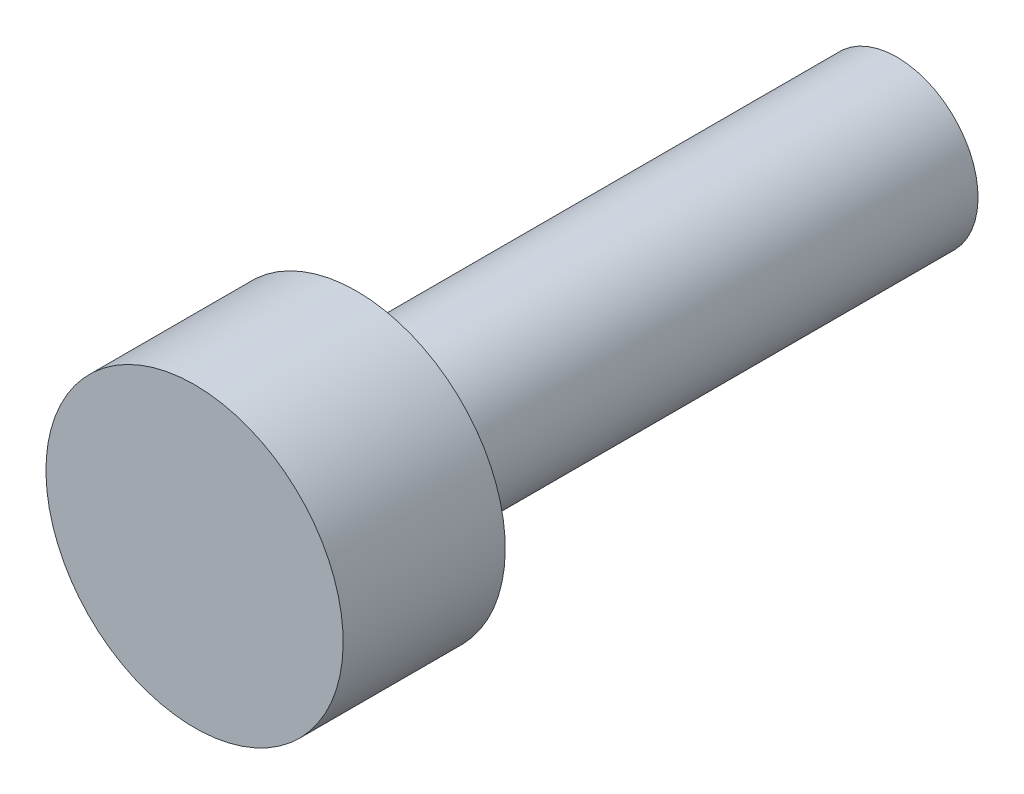
ISO-10303-21;
HEADER;
FILE_DESCRIPTION(('STEP AP214'),'2;1');
FILE_NAME('part.step','',(''),(''),'','','');
FILE_SCHEMA(('AUTOMOTIVE_DESIGN { 1 0 10303 214 1 1 1 1 }'));
ENDSEC;
DATA;
#1=APPLICATION_CONTEXT('core data for automotive mechanical design processes');
#2=APPLICATION_PROTOCOL_DEFINITION('international standard','automotive_design',2000,#1);
#3=PRODUCT_CONTEXT('',#1,'mechanical');
#4=PRODUCT('Part','Part','',(#3));
#5=PRODUCT_RELATED_PRODUCT_CATEGORY('part','',(#4));
#6=PRODUCT_DEFINITION_FORMATION('','',#4);
#7=PRODUCT_DEFINITION_CONTEXT('part definition',#1,'design');
#8=PRODUCT_DEFINITION('design','',#6,#7);
#9=PRODUCT_DEFINITION_SHAPE('','',#8);
#10=(LENGTH_UNIT() NAMED_UNIT(*) SI_UNIT(.MILLI.,.METRE.));
#11=(NAMED_UNIT(*) PLANE_ANGLE_UNIT() SI_UNIT($,.RADIAN.));
#12=(NAMED_UNIT(*) SI_UNIT($,.STERADIAN.) SOLID_ANGLE_UNIT());
#13=UNCERTAINTY_MEASURE_WITH_UNIT(LENGTH_MEASURE(1.E-05),#10,'distance_accuracy_value','');
#14=(GEOMETRIC_REPRESENTATION_CONTEXT(3) GLOBAL_UNCERTAINTY_ASSIGNED_CONTEXT((#13)) GLOBAL_UNIT_ASSIGNED_CONTEXT((#10,
#11,#12)) REPRESENTATION_CONTEXT('',''));
#15=CARTESIAN_POINT('',(0.,0.,0.));
#16=DIRECTION('',(0.,0.,1.));
#17=DIRECTION('',(1.,0.,0.));
#18=AXIS2_PLACEMENT_3D('',#15,#16,#17);
#19=CARTESIAN_POINT('',(0.,0.,0.));
#20=DIRECTION('',(0.,0.,1.));
#21=DIRECTION('',(0.,-1.,0.));
#22=AXIS2_PLACEMENT_3D('',#19,#20,#21);
#23=PLANE('',#22);
#24=CARTESIAN_POINT('',(0.,0.,0.));
#25=DIRECTION('',(0.,0.,-1.));
#26=DIRECTION('',(0.,1.,0.));
#27=AXIS2_PLACEMENT_3D('',#24,#25,#26);
#28=CIRCLE('',#27,2.75);
#29=CARTESIAN_POINT('',(0.,2.75,0.));
#30=VERTEX_POINT('',#29);
#31=EDGE_CURVE('E10',#30,#30,#28,.T.);
#32=ORIENTED_EDGE('',*,*,#31,.F.);
#33=EDGE_LOOP('',(#32));
#34=FACE_BOUND('',#33,.T.);
#35=ADVANCED_FACE('F37',(#34),#23,.T.);
#36=CARTESIAN_POINT('',(0.,0.,-13.));
#37=DIRECTION('',(0.,0.,-1.));
#38=DIRECTION('',(0.,1.,0.));
#39=AXIS2_PLACEMENT_3D('',#36,#37,#38);
#40=CYLINDRICAL_SURFACE('',#39,2.75);
#41=ORIENTED_EDGE('',*,*,#31,.T.);
#42=EDGE_LOOP('',(#41));
#43=FACE_BOUND('',#42,.T.);
#44=CARTESIAN_POINT('',(0.,0.,-3.));
#45=DIRECTION('',(0.,0.,-1.));
#46=DIRECTION('',(0.,1.,0.));
#47=AXIS2_PLACEMENT_3D('',#44,#45,#46);
#48=CIRCLE('',#47,2.75000000000001);
#49=CARTESIAN_POINT('',(0.,2.75,-3.));
#50=VERTEX_POINT('',#49);
#51=EDGE_CURVE('E44',#50,#50,#48,.T.);
#52=ORIENTED_EDGE('',*,*,#51,.F.);
#53=EDGE_LOOP('',(#52));
#54=FACE_BOUND('',#53,.T.);
#55=ADVANCED_FACE('F73',(#43,#54),#40,.T.);
#56=CARTESIAN_POINT('',(0.,2.75,-3.));
#57=DIRECTION('',(0.,0.,-1.));
#58=DIRECTION('',(0.,1.,0.));
#59=AXIS2_PLACEMENT_3D('',#56,#57,#58);
#60=PLANE('',#59);
#61=ORIENTED_EDGE('',*,*,#51,.T.);
#62=EDGE_LOOP('',(#61));
#63=FACE_BOUND('',#62,.T.);
#64=CARTESIAN_POINT('',(0.,0.,-3.));
#65=DIRECTION('',(0.,0.,-1.));
#66=DIRECTION('',(0.,1.,0.));
#67=AXIS2_PLACEMENT_3D('',#64,#65,#66);
#68=CIRCLE('',#67,1.50000000000001);
#69=CARTESIAN_POINT('',(0.,1.5,-3.));
#70=VERTEX_POINT('',#69);
#71=EDGE_CURVE('E49',#70,#70,#68,.T.);
#72=ORIENTED_EDGE('',*,*,#71,.F.);
#73=EDGE_LOOP('',(#72));
#74=FACE_BOUND('',#73,.T.);
#75=ADVANCED_FACE('F65',(#63,#74),#60,.T.);
#76=CARTESIAN_POINT('',(0.,0.,-13.));
#77=DIRECTION('',(0.,0.,-1.));
#78=DIRECTION('',(0.,1.,0.));
#79=AXIS2_PLACEMENT_3D('',#76,#77,#78);
#80=CYLINDRICAL_SURFACE('',#79,1.50000000000002);
#81=ORIENTED_EDGE('',*,*,#71,.T.);
#82=EDGE_LOOP('',(#81));
#83=FACE_BOUND('',#82,.T.);
#84=CARTESIAN_POINT('',(0.,0.,-13.));
#85=DIRECTION('',(0.,0.,-1.));
#86=DIRECTION('',(0.,1.,0.));
#87=AXIS2_PLACEMENT_3D('',#84,#85,#86);
#88=CIRCLE('',#87,1.50000000000003);
#89=CARTESIAN_POINT('',(0.,1.5,-13.));
#90=VERTEX_POINT('',#89);
#91=EDGE_CURVE('E54',#90,#90,#88,.T.);
#92=ORIENTED_EDGE('',*,*,#91,.F.);
#93=EDGE_LOOP('',(#92));
#94=FACE_BOUND('',#93,.T.);
#95=ADVANCED_FACE('F63',(#83,#94),#80,.T.);
#96=CARTESIAN_POINT('',(0.,1.5,-13.));
#97=DIRECTION('',(0.,0.,-1.));
#98=DIRECTION('',(0.,1.,0.));
#99=AXIS2_PLACEMENT_3D('',#96,#97,#98);
#100=PLANE('',#99);
#101=ORIENTED_EDGE('',*,*,#91,.T.);
#102=EDGE_LOOP('',(#101));
#103=FACE_BOUND('',#102,.T.);
#104=ADVANCED_FACE('F61',(#103),#100,.T.);
#105=CLOSED_SHELL('',(#35,#55,#75,#95,#104));
#106=MANIFOLD_SOLID_BREP('B2',#105);
#107=ADVANCED_BREP_SHAPE_REPRESENTATION('',(#18,#106),#14);
#108=SHAPE_DEFINITION_REPRESENTATION(#9,#107);
ENDSEC;
END-ISO-10303-21;
